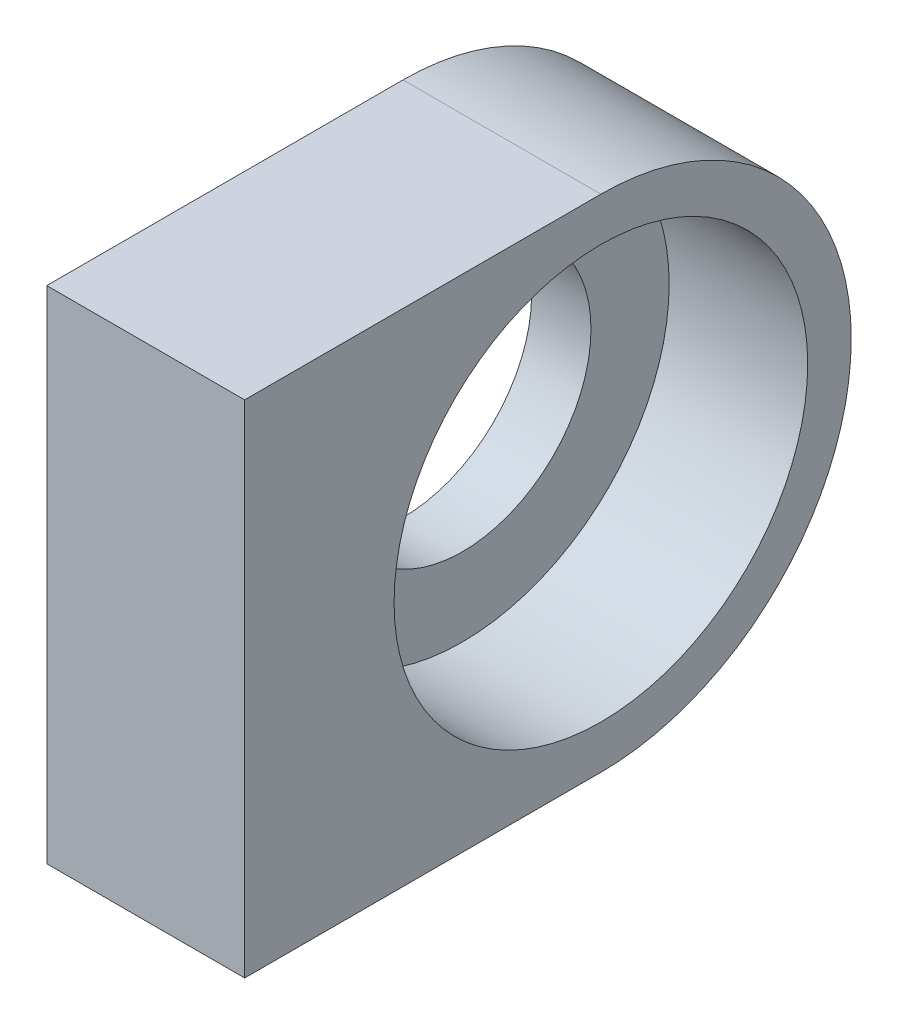
ISO-10303-21;
HEADER;
FILE_DESCRIPTION(('STEP AP214'),'2;1');
FILE_NAME('part.step','',(''),(''),'','','');
FILE_SCHEMA(('AUTOMOTIVE_DESIGN { 1 0 10303 214 1 1 1 1 }'));
ENDSEC;
DATA;
#1=APPLICATION_CONTEXT('core data for automotive mechanical design processes');
#2=APPLICATION_PROTOCOL_DEFINITION('international standard','automotive_design',2000,#1);
#3=PRODUCT_CONTEXT('',#1,'mechanical');
#4=PRODUCT('Part','Part','',(#3));
#5=PRODUCT_RELATED_PRODUCT_CATEGORY('part','',(#4));
#6=PRODUCT_DEFINITION_FORMATION('','',#4);
#7=PRODUCT_DEFINITION_CONTEXT('part definition',#1,'design');
#8=PRODUCT_DEFINITION('design','',#6,#7);
#9=PRODUCT_DEFINITION_SHAPE('','',#8);
#10=(LENGTH_UNIT() NAMED_UNIT(*) SI_UNIT(.MILLI.,.METRE.));
#11=(NAMED_UNIT(*) PLANE_ANGLE_UNIT() SI_UNIT($,.RADIAN.));
#12=(NAMED_UNIT(*) SI_UNIT($,.STERADIAN.) SOLID_ANGLE_UNIT());
#13=UNCERTAINTY_MEASURE_WITH_UNIT(LENGTH_MEASURE(1.E-05),#10,'distance_accuracy_value','');
#14=(GEOMETRIC_REPRESENTATION_CONTEXT(3) GLOBAL_UNCERTAINTY_ASSIGNED_CONTEXT((#13)) GLOBAL_UNIT_ASSIGNED_CONTEXT((#10,
#11,#12)) REPRESENTATION_CONTEXT('',''));
#15=CARTESIAN_POINT('',(0.,0.,0.));
#16=DIRECTION('',(0.,0.,1.));
#17=DIRECTION('',(1.,0.,0.));
#18=AXIS2_PLACEMENT_3D('',#15,#16,#17);
#19=CARTESIAN_POINT('',(10.,0.,0.));
#20=DIRECTION('',(-1.,0.,0.));
#21=DIRECTION('',(0.,0.,1.));
#22=AXIS2_PLACEMENT_3D('',#19,#20,#21);
#23=CYLINDRICAL_SURFACE('',#22,12.65);
#24=CARTESIAN_POINT('',(0.,0.,0.));
#25=DIRECTION('',(1.,0.,0.));
#26=DIRECTION('',(0.,0.,-1.));
#27=AXIS2_PLACEMENT_3D('',#24,#25,#26);
#28=CIRCLE('',#27,12.65);
#29=CARTESIAN_POINT('',(0.,-12.65,0.));
#30=VERTEX_POINT('',#29);
#31=CARTESIAN_POINT('',(0.,12.65,0.));
#32=VERTEX_POINT('',#31);
#33=EDGE_CURVE('E102',#30,#32,#28,.T.);
#34=ORIENTED_EDGE('',*,*,#33,.T.);
#35=DIRECTION('',(-1.,0.,0.));
#36=VECTOR('',#35,1.);
#37=CARTESIAN_POINT('',(10.,12.65,0.));
#38=LINE('',#37,#36);
#39=CARTESIAN_POINT('',(10.,12.65,0.));
#40=VERTEX_POINT('',#39);
#41=EDGE_CURVE('E11',#40,#32,#38,.T.);
#42=ORIENTED_EDGE('',*,*,#41,.F.);
#43=CARTESIAN_POINT('',(10.,0.,0.));
#44=DIRECTION('',(1.,0.,0.));
#45=DIRECTION('',(0.,0.,-1.));
#46=AXIS2_PLACEMENT_3D('',#43,#44,#45);
#47=CIRCLE('',#46,12.65);
#48=CARTESIAN_POINT('',(10.,-12.65,0.));
#49=VERTEX_POINT('',#48);
#50=EDGE_CURVE('E90',#49,#40,#47,.T.);
#51=ORIENTED_EDGE('',*,*,#50,.F.);
#52=DIRECTION('',(-1.,0.,0.));
#53=VECTOR('',#52,1.);
#54=CARTESIAN_POINT('',(10.,-12.65,0.));
#55=LINE('',#54,#53);
#56=EDGE_CURVE('E98',#49,#30,#55,.T.);
#57=ORIENTED_EDGE('',*,*,#56,.T.);
#58=EDGE_LOOP('',(#34,#42,#51,#57));
#59=FACE_BOUND('',#58,.T.);
#60=ADVANCED_FACE('F39',(#59),#23,.T.);
#61=CARTESIAN_POINT('',(10.,12.65,0.));
#62=DIRECTION('',(0.,-1.,0.));
#63=DIRECTION('',(0.,0.,-1.));
#64=AXIS2_PLACEMENT_3D('',#61,#62,#63);
#65=PLANE('',#64);
#66=DIRECTION('',(0.,0.,1.));
#67=VECTOR('',#66,1.);
#68=CARTESIAN_POINT('',(0.,12.65,0.));
#69=LINE('',#68,#67);
#70=CARTESIAN_POINT('',(0.,12.65,18.));
#71=VERTEX_POINT('',#70);
#72=EDGE_CURVE('E94',#32,#71,#69,.T.);
#73=ORIENTED_EDGE('',*,*,#72,.T.);
#74=DIRECTION('',(-1.,0.,0.));
#75=VECTOR('',#74,1.);
#76=CARTESIAN_POINT('',(10.,12.65,18.));
#77=LINE('',#76,#75);
#78=CARTESIAN_POINT('',(10.,12.65,18.));
#79=VERTEX_POINT('',#78);
#80=EDGE_CURVE('E47',#79,#71,#77,.T.);
#81=ORIENTED_EDGE('',*,*,#80,.F.);
#82=DIRECTION('',(0.,0.,1.));
#83=VECTOR('',#82,1.);
#84=CARTESIAN_POINT('',(10.,12.65,0.));
#85=LINE('',#84,#83);
#86=EDGE_CURVE('E85',#40,#79,#85,.T.);
#87=ORIENTED_EDGE('',*,*,#86,.F.);
#88=ORIENTED_EDGE('',*,*,#41,.T.);
#89=EDGE_LOOP('',(#73,#81,#87,#88));
#90=FACE_BOUND('',#89,.T.);
#91=ADVANCED_FACE('F93',(#90),#65,.F.);
#92=CARTESIAN_POINT('',(10.,-12.65,18.));
#93=DIRECTION('',(0.,0.,-1.));
#94=DIRECTION('',(-1.,0.,0.));
#95=AXIS2_PLACEMENT_3D('',#92,#93,#94);
#96=PLANE('',#95);
#97=DIRECTION('',(0.,-1.,0.));
#98=VECTOR('',#97,1.);
#99=CARTESIAN_POINT('',(0.,-12.65,18.));
#100=LINE('',#99,#98);
#101=CARTESIAN_POINT('',(0.,-12.65,18.));
#102=VERTEX_POINT('',#101);
#103=EDGE_CURVE('E72',#71,#102,#100,.T.);
#104=ORIENTED_EDGE('',*,*,#103,.T.);
#105=DIRECTION('',(-1.,0.,0.));
#106=VECTOR('',#105,1.);
#107=CARTESIAN_POINT('',(10.,-12.65,18.));
#108=LINE('',#107,#106);
#109=CARTESIAN_POINT('',(10.,-12.65,18.));
#110=VERTEX_POINT('',#109);
#111=EDGE_CURVE('E95',#110,#102,#108,.T.);
#112=ORIENTED_EDGE('',*,*,#111,.F.);
#113=DIRECTION('',(0.,-1.,0.));
#114=VECTOR('',#113,1.);
#115=CARTESIAN_POINT('',(10.,-12.65,18.));
#116=LINE('',#115,#114);
#117=EDGE_CURVE('E88',#79,#110,#116,.T.);
#118=ORIENTED_EDGE('',*,*,#117,.F.);
#119=ORIENTED_EDGE('',*,*,#80,.T.);
#120=EDGE_LOOP('',(#104,#112,#118,#119));
#121=FACE_BOUND('',#120,.T.);
#122=ADVANCED_FACE('F96',(#121),#96,.F.);
#123=CARTESIAN_POINT('',(10.,-12.65,0.));
#124=DIRECTION('',(0.,1.,0.));
#125=DIRECTION('',(0.,0.,1.));
#126=AXIS2_PLACEMENT_3D('',#123,#124,#125);
#127=PLANE('',#126);
#128=DIRECTION('',(0.,0.,-1.));
#129=VECTOR('',#128,1.);
#130=CARTESIAN_POINT('',(0.,-12.65,0.));
#131=LINE('',#130,#129);
#132=EDGE_CURVE('E78',#102,#30,#131,.T.);
#133=ORIENTED_EDGE('',*,*,#132,.T.);
#134=ORIENTED_EDGE('',*,*,#56,.F.);
#135=DIRECTION('',(0.,0.,-1.));
#136=VECTOR('',#135,1.);
#137=CARTESIAN_POINT('',(10.,-12.65,0.));
#138=LINE('',#137,#136);
#139=EDGE_CURVE('E55',#110,#49,#138,.T.);
#140=ORIENTED_EDGE('',*,*,#139,.F.);
#141=ORIENTED_EDGE('',*,*,#111,.T.);
#142=EDGE_LOOP('',(#133,#134,#140,#141));
#143=FACE_BOUND('',#142,.T.);
#144=ADVANCED_FACE('F110',(#143),#127,.F.);
#145=CARTESIAN_POINT('',(10.,0.,0.));
#146=DIRECTION('',(1.,0.,0.));
#147=DIRECTION('',(0.,0.,-1.));
#148=AXIS2_PLACEMENT_3D('',#145,#146,#147);
#149=PLANE('',#148);
#150=CARTESIAN_POINT('',(10.,0.,0.));
#151=DIRECTION('',(1.,0.,0.));
#152=DIRECTION('',(0.,0.,-1.));
#153=AXIS2_PLACEMENT_3D('',#150,#151,#152);
#154=CIRCLE('',#153,10.45);
#155=CARTESIAN_POINT('',(10.,0.,-10.45));
#156=VERTEX_POINT('',#155);
#157=EDGE_CURVE('E116',#156,#156,#154,.T.);
#158=ORIENTED_EDGE('',*,*,#157,.F.);
#159=EDGE_LOOP('',(#158));
#160=FACE_BOUND('',#159,.T.);
#161=ORIENTED_EDGE('',*,*,#50,.T.);
#162=ORIENTED_EDGE('',*,*,#86,.T.);
#163=ORIENTED_EDGE('',*,*,#117,.T.);
#164=ORIENTED_EDGE('',*,*,#139,.T.);
#165=EDGE_LOOP('',(#161,#162,#163,#164));
#166=FACE_BOUND('',#165,.T.);
#167=ADVANCED_FACE('F86',(#160,#166),#149,.T.);
#168=CARTESIAN_POINT('',(0.,0.,0.));
#169=DIRECTION('',(1.,0.,0.));
#170=DIRECTION('',(0.,0.,-1.));
#171=AXIS2_PLACEMENT_3D('',#168,#169,#170);
#172=PLANE('',#171);
#173=CARTESIAN_POINT('',(0.,0.,0.));
#174=DIRECTION('',(1.,0.,0.));
#175=DIRECTION('',(0.,0.,-1.));
#176=AXIS2_PLACEMENT_3D('',#173,#174,#175);
#177=CIRCLE('',#176,6.5);
#178=CARTESIAN_POINT('',(0.,0.,-6.5));
#179=VERTEX_POINT('',#178);
#180=EDGE_CURVE('E119',#179,#179,#177,.T.);
#181=ORIENTED_EDGE('',*,*,#180,.T.);
#182=EDGE_LOOP('',(#181));
#183=FACE_BOUND('',#182,.T.);
#184=ORIENTED_EDGE('',*,*,#33,.F.);
#185=ORIENTED_EDGE('',*,*,#132,.F.);
#186=ORIENTED_EDGE('',*,*,#103,.F.);
#187=ORIENTED_EDGE('',*,*,#72,.F.);
#188=EDGE_LOOP('',(#184,#185,#186,#187));
#189=FACE_BOUND('',#188,.T.);
#190=ADVANCED_FACE('F113',(#183,#189),#172,.F.);
#191=CARTESIAN_POINT('',(3.,0.,0.));
#192=DIRECTION('',(1.,0.,0.));
#193=DIRECTION('',(0.,0.,-1.));
#194=AXIS2_PLACEMENT_3D('',#191,#192,#193);
#195=CYLINDRICAL_SURFACE('',#194,10.45);
#196=CARTESIAN_POINT('',(3.,0.,0.));
#197=DIRECTION('',(1.,0.,0.));
#198=DIRECTION('',(0.,0.,-1.));
#199=AXIS2_PLACEMENT_3D('',#196,#197,#198);
#200=CIRCLE('',#199,10.45);
#201=CARTESIAN_POINT('',(3.,0.,-10.45));
#202=VERTEX_POINT('',#201);
#203=EDGE_CURVE('E105',#202,#202,#200,.T.);
#204=ORIENTED_EDGE('',*,*,#203,.F.);
#205=EDGE_LOOP('',(#204));
#206=FACE_BOUND('',#205,.T.);
#207=ORIENTED_EDGE('',*,*,#157,.T.);
#208=EDGE_LOOP('',(#207));
#209=FACE_BOUND('',#208,.T.);
#210=ADVANCED_FACE('F138',(#206,#209),#195,.F.);
#211=CARTESIAN_POINT('',(3.,0.,0.));
#212=DIRECTION('',(1.,0.,0.));
#213=DIRECTION('',(0.,0.,-1.));
#214=AXIS2_PLACEMENT_3D('',#211,#212,#213);
#215=PLANE('',#214);
#216=CARTESIAN_POINT('',(3.,0.,0.));
#217=DIRECTION('',(1.,0.,0.));
#218=DIRECTION('',(0.,0.,-1.));
#219=AXIS2_PLACEMENT_3D('',#216,#217,#218);
#220=CIRCLE('',#219,6.5);
#221=CARTESIAN_POINT('',(3.,0.,-6.5));
#222=VERTEX_POINT('',#221);
#223=EDGE_CURVE('E122',#222,#222,#220,.T.);
#224=ORIENTED_EDGE('',*,*,#223,.F.);
#225=EDGE_LOOP('',(#224));
#226=FACE_BOUND('',#225,.T.);
#227=ORIENTED_EDGE('',*,*,#203,.T.);
#228=EDGE_LOOP('',(#227));
#229=FACE_BOUND('',#228,.T.);
#230=ADVANCED_FACE('F132',(#226,#229),#215,.T.);
#231=CARTESIAN_POINT('',(0.,0.,0.));
#232=DIRECTION('',(1.,0.,0.));
#233=DIRECTION('',(0.,0.,-1.));
#234=AXIS2_PLACEMENT_3D('',#231,#232,#233);
#235=CYLINDRICAL_SURFACE('',#234,6.5);
#236=ORIENTED_EDGE('',*,*,#180,.F.);
#237=EDGE_LOOP('',(#236));
#238=FACE_BOUND('',#237,.T.);
#239=ORIENTED_EDGE('',*,*,#223,.T.);
#240=EDGE_LOOP('',(#239));
#241=FACE_BOUND('',#240,.T.);
#242=ADVANCED_FACE('F129',(#238,#241),#235,.F.);
#243=CLOSED_SHELL('',(#60,#91,#122,#144,#167,#190,#210,#230,#242));
#244=MANIFOLD_SOLID_BREP('B2',#243);
#245=ADVANCED_BREP_SHAPE_REPRESENTATION('',(#18,#244),#14);
#246=SHAPE_DEFINITION_REPRESENTATION(#9,#245);
ENDSEC;
END-ISO-10303-21;
